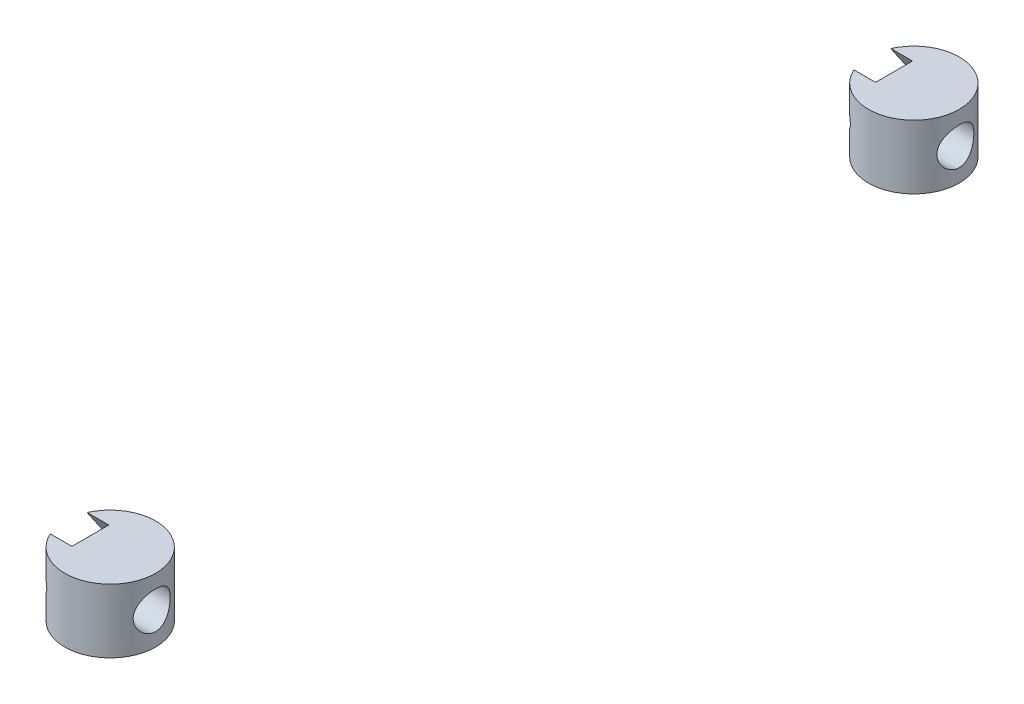
ISO-10303-21;
HEADER;
FILE_DESCRIPTION(('STEP AP214'),'2;1');
FILE_NAME('part.step','',(''),(''),'','','');
FILE_SCHEMA(('AUTOMOTIVE_DESIGN { 1 0 10303 214 1 1 1 1 }'));
ENDSEC;
DATA;
#1=APPLICATION_CONTEXT('core data for automotive mechanical design processes');
#2=APPLICATION_PROTOCOL_DEFINITION('international standard','automotive_design',2000,#1);
#3=PRODUCT_CONTEXT('',#1,'mechanical');
#4=PRODUCT('Part','Part','',(#3));
#5=PRODUCT_RELATED_PRODUCT_CATEGORY('part','',(#4));
#6=PRODUCT_DEFINITION_FORMATION('','',#4);
#7=PRODUCT_DEFINITION_CONTEXT('part definition',#1,'design');
#8=PRODUCT_DEFINITION('design','',#6,#7);
#9=PRODUCT_DEFINITION_SHAPE('','',#8);
#10=(LENGTH_UNIT() NAMED_UNIT(*) SI_UNIT(.MILLI.,.METRE.));
#11=(NAMED_UNIT(*) PLANE_ANGLE_UNIT() SI_UNIT($,.RADIAN.));
#12=(NAMED_UNIT(*) SI_UNIT($,.STERADIAN.) SOLID_ANGLE_UNIT());
#13=UNCERTAINTY_MEASURE_WITH_UNIT(LENGTH_MEASURE(1.E-05),#10,'distance_accuracy_value','');
#14=(GEOMETRIC_REPRESENTATION_CONTEXT(3) GLOBAL_UNCERTAINTY_ASSIGNED_CONTEXT((#13)) GLOBAL_UNIT_ASSIGNED_CONTEXT((#10,
#11,#12)) REPRESENTATION_CONTEXT('',''));
#15=CARTESIAN_POINT('',(0.,0.,0.));
#16=DIRECTION('',(0.,0.,1.));
#17=DIRECTION('',(1.,0.,0.));
#18=AXIS2_PLACEMENT_3D('',#15,#16,#17);
#19=CARTESIAN_POINT('',(-9.025,6.35,79.875));
#20=DIRECTION('',(1.,0.,0.));
#21=DIRECTION('',(0.,0.,-1.));
#22=AXIS2_PLACEMENT_3D('',#19,#20,#21);
#23=CYLINDRICAL_SURFACE('',#22,3.675);
#24=CARTESIAN_POINT('',(8.24287571178894,6.35,76.2));
#25=CARTESIAN_POINT('',(8.24287635200835,6.25172209193004,76.2000006435663));
#26=CARTESIAN_POINT('',(8.24463950445115,6.15340636895207,76.2039482242921));
#27=CARTESIAN_POINT('',(8.2516341947821,5.95748755176272,76.2196983826287));
#28=CARTESIAN_POINT('',(8.25686806215964,5.85988498072126,76.2315062359517));
#29=CARTESIAN_POINT('',(8.27064458742844,5.66594535724324,76.2628872681414));
#30=CARTESIAN_POINT('',(8.27919443665083,5.56961152904888,76.2824773264413));
#31=CARTESIAN_POINT('',(8.29931572789662,5.37910343025143,76.3292104976651));
#32=CARTESIAN_POINT('',(8.31088843780253,5.28493008389492,76.3563567802206));
#33=CARTESIAN_POINT('',(8.34950112738414,5.00742795623176,76.4484965304055));
#34=CARTESIAN_POINT('',(8.38051193052206,4.8281262358787,76.524354005083));
#35=CARTESIAN_POINT('',(8.44955969315188,4.48494141418247,76.7025187377141));
#36=CARTESIAN_POINT('',(8.48759476947753,4.32105419803325,76.8048189094671));
#37=CARTESIAN_POINT('',(8.56894038089361,4.00339374462748,77.0394933161994));
#38=CARTESIAN_POINT('',(8.61242467515414,3.85063969934235,77.1731899136823));
#39=CARTESIAN_POINT('',(8.69833612153945,3.56897779638049,77.4640749448378));
#40=CARTESIAN_POINT('',(8.74076287145229,3.44007889521944,77.6212721620351));
#41=CARTESIAN_POINT('',(8.821874135843,3.20465562489746,77.962635283187));
#42=CARTESIAN_POINT('',(8.86033318135837,3.09926856531821,78.1476440521105));
#43=CARTESIAN_POINT('',(8.92706239153422,2.92155175218724,78.534611041429));
#44=CARTESIAN_POINT('',(8.95533688584077,2.84920794780613,78.7365620142475));
#45=CARTESIAN_POINT('',(8.99728123604548,2.74329576015924,79.1409766868008));
#46=CARTESIAN_POINT('',(9.01161028022033,2.70797042253651,79.3429105009561));
#47=CARTESIAN_POINT('',(9.02643689795595,2.67143219850026,79.7503140089371));
#48=CARTESIAN_POINT('',(9.02693981697954,2.67020612861014,79.9557823055151));
#49=CARTESIAN_POINT('',(9.01445308137315,2.70095617123781,80.3516899570414));
#50=CARTESIAN_POINT('',(9.00224664639766,2.73100491781053,80.542308253818));
#51=CARTESIAN_POINT('',(8.96677695328529,2.82016237175298,80.9155239627416));
#52=CARTESIAN_POINT('',(8.94351288226197,2.87927321559261,81.098120784123));
#53=CARTESIAN_POINT('',(8.88774687972276,3.02559431545221,81.4534294263568));
#54=CARTESIAN_POINT('',(8.85511017828501,3.11321719115932,81.625949297497));
#55=CARTESIAN_POINT('',(8.78381848591454,3.31368115092225,81.95428510923));
#56=CARTESIAN_POINT('',(8.74516140393479,3.42653100296634,82.1100952141811));
#57=CARTESIAN_POINT('',(8.66264265950523,3.68314666108434,82.4117978955274));
#58=CARTESIAN_POINT('',(8.61860582477254,3.82848885606257,82.5563037368879));
#59=CARTESIAN_POINT('',(8.53228763369566,4.14148509819779,82.8194720867788));
#60=CARTESIAN_POINT('',(8.4900068992191,4.30914696225721,82.9381255025843));
#61=CARTESIAN_POINT('',(8.41077118272341,4.66844482022331,83.1495565547352));
#62=CARTESIAN_POINT('',(8.37401547120769,4.8606516918592,83.2414450666085));
#63=CARTESIAN_POINT('',(8.31234279260891,5.25970641210512,83.3909925670086));
#64=CARTESIAN_POINT('',(8.28741780684716,5.46654423452068,83.4486747466771));
#65=CARTESIAN_POINT('',(8.25419279568773,5.87512708363286,83.5247333104287));
#66=CARTESIAN_POINT('',(8.24494769967969,6.07637724944273,83.5453490013328));
#67=CARTESIAN_POINT('',(8.24143255370913,6.47963007174617,83.5532403958429));
#68=CARTESIAN_POINT('',(8.24715769792191,6.68163246596572,83.5405267989876));
#69=CARTESIAN_POINT('',(8.27196520700345,7.06791511332102,83.4841614945367));
#70=CARTESIAN_POINT('',(8.29022645502155,7.25253191562638,83.4424096999523));
#71=CARTESIAN_POINT('',(8.33701683509443,7.61200484974517,83.3316404564726));
#72=CARTESIAN_POINT('',(8.36554829622212,7.78685875713687,83.2626168225386));
#73=CARTESIAN_POINT('',(8.43110547035255,8.12991416969162,83.0960844521227));
#74=CARTESIAN_POINT('',(8.4684336851875,8.29754146280155,82.9975156956635));
#75=CARTESIAN_POINT('',(8.54693065916348,8.6146579401236,82.7757621673222));
#76=CARTESIAN_POINT('',(8.58810102148374,8.76413949242629,82.6525670951274));
#77=CARTESIAN_POINT('',(8.67347379009378,9.05270258610971,82.3738565151429));
#78=CARTESIAN_POINT('',(8.7176653360997,9.19009474251,82.2165818364197));
#79=CARTESIAN_POINT('',(8.80113256404693,9.43681675245223,81.8801663884421));
#80=CARTESIAN_POINT('',(8.8404079792371,9.54614508357813,81.7010244337018));
#81=CARTESIAN_POINT('',(8.90979537682365,9.73334723914072,81.325067867124));
#82=CARTESIAN_POINT('',(8.93989906023429,9.81119259712773,81.1282374572668));
#83=CARTESIAN_POINT('',(8.98740936617443,9.93212958495293,80.7227415304938));
#84=CARTESIAN_POINT('',(9.00482316773469,9.97524086631648,80.5140827773405));
#85=CARTESIAN_POINT('',(9.02419972547081,10.0230925942599,80.1059920022592));
#86=CARTESIAN_POINT('',(9.02712289370004,10.030218715373,79.9068832759984));
#87=CARTESIAN_POINT('',(9.01981023820307,10.012246501791,79.5103938060765));
#88=CARTESIAN_POINT('',(9.00957654258989,9.98715337853588,79.3130127881586));
#89=CARTESIAN_POINT('',(8.97759134956026,9.90716465674415,78.9322188325613));
#90=CARTESIAN_POINT('',(8.95622770323864,9.85327114355812,78.748560172301));
#91=CARTESIAN_POINT('',(8.90429361461325,9.71828048169847,78.39293867393));
#92=CARTESIAN_POINT('',(8.87372138448023,9.6371780501162,78.220978114938));
#93=CARTESIAN_POINT('',(8.80465480899495,9.44600292489272,77.8851814845139));
#94=CARTESIAN_POINT('',(8.76586746309063,9.3347974441483,77.722052025764));
#95=CARTESIAN_POINT('',(8.68501247715117,9.08824463756887,77.4160839970443));
#96=CARTESIAN_POINT('',(8.64294369237785,8.95288886545331,77.2732525575668));
#97=CARTESIAN_POINT('',(8.55688244327784,8.65160917107083,77.0023925863474));
#98=CARTESIAN_POINT('',(8.51294070594262,8.48427751251768,76.8759110416483));
#99=CARTESIAN_POINT('',(8.43095316803738,8.12922979473681,76.6525971381483));
#100=CARTESIAN_POINT('',(8.39291059170069,7.94150268286357,76.5557809651779));
#101=CARTESIAN_POINT('',(8.34409768743806,7.64929494245797,76.4357432301747));
#102=CARTESIAN_POINT('',(8.32923800988524,7.55047135087831,76.4000064683778));
#103=CARTESIAN_POINT('',(8.30268862303679,7.34975217087458,76.337040054348));
#104=CARTESIAN_POINT('',(8.29099737229579,7.24785810315077,76.3098062644197));
#105=CARTESIAN_POINT('',(8.27124353271442,7.04205504875809,76.2642146240913));
#106=CARTESIAN_POINT('',(8.2631713477964,6.93815216178343,76.2458332913668));
#107=CARTESIAN_POINT('',(8.25092373196701,6.72897571172968,76.218072851351));
#108=CARTESIAN_POINT('',(8.24674523427927,6.62370329371421,76.2086866590708));
#109=CARTESIAN_POINT('',(8.24402032780168,6.49021203930896,76.202568404048));
#110=CARTESIAN_POINT('',(8.24359134458015,6.46218098581238,76.2016054991886));
#111=CARTESIAN_POINT('',(8.24301894449513,6.40610098190794,76.2003212037259));
#112=CARTESIAN_POINT('',(8.24287552904742,6.37805203141203,76.1999998163031));
#113=CARTESIAN_POINT('',(8.24287571178894,6.35,76.2));
#114=B_SPLINE_CURVE_WITH_KNOTS('',3,(#24,#25,#26,#27,#28,#29,#30,#31,#32,#33,#34,#35,#36,#37,
#38,#39,#40,#41,#42,#43,#44,#45,#46,#47,#48,#49,#50,#51,#52,#53,#54,#55,#56,#57,#58,#59,#60,#61,
#62,#63,#64,#65,#66,#67,#68,#69,#70,#71,#72,#73,#74,#75,#76,#77,#78,#79,#80,#81,#82,#83,#84,#85,
#86,#87,#88,#89,#90,#91,#92,#93,#94,#95,#96,#97,#98,#99,#100,#101,#102,#103,#104,#105,#106,#107,
#108,#109,#110,#111,#112,#113),.UNSPECIFIED.,.T.,.F.,(4,2,2,2,2,2,2,2,2,2,2,2,2,2,2,2,2,2,2,2,2,
2,2,2,2,2,2,2,2,2,2,2,2,2,2,2,2,2,2,2,2,2,2,2,4),(0.,0.294804188916927,0.58980644632139,
0.885452081677048,1.18122191975236,1.76977849951031,2.35817751917346,2.9782472090168,
3.59854923644961,4.24434528218109,4.88986646283033,5.50313117295886,6.11615877906913,
6.69352390455187,7.27093148077985,7.857097336015,8.44346723902179,9.06955698195067,
9.69586657677613,10.3410804714088,10.9858564235891,11.5901727785578,12.1942951565536,
12.7622100645096,13.3302538450987,13.9217907040224,14.5135755014523,15.1509685846609,
15.7883962380846,16.4263989627131,17.0640404700697,17.658796487591,18.253456315868,
18.8286572916528,19.4039700136862,20.0049956742599,20.6062319500066,21.2462114962225,
21.8865396047503,22.2045804601897,22.5224663092809,22.839504214647,23.1562922005524,
23.2404394471741,23.3245871109808),.UNSPECIFIED.);
#115=CARTESIAN_POINT('',(8.24287571178894,6.35,76.2));
#116=VERTEX_POINT('',#115);
#117=EDGE_CURVE('E12',#116,#116,#114,.T.);
#118=ORIENTED_EDGE('',*,*,#117,.F.);
#119=EDGE_LOOP('',(#118));
#120=FACE_BOUND('',#119,.T.);
#121=CARTESIAN_POINT('',(-3.945,6.35,79.875));
#122=DIRECTION('',(-1.,0.,0.));
#123=DIRECTION('',(0.,0.,1.));
#124=AXIS2_PLACEMENT_3D('',#121,#122,#123);
#125=CIRCLE('',#124,3.675);
#126=CARTESIAN_POINT('',(-3.945,6.35,83.55));
#127=VERTEX_POINT('',#126);
#128=EDGE_CURVE('E54',#127,#127,#125,.F.);
#129=ORIENTED_EDGE('',*,*,#128,.F.);
#130=EDGE_LOOP('',(#129));
#131=FACE_BOUND('',#130,.T.);
#132=ADVANCED_FACE('F49',(#120,#131),#23,.F.);
#133=CARTESIAN_POINT('',(0.,12.7,79.875));
#134=DIRECTION('',(0.,-1.,0.));
#135=DIRECTION('',(0.,0.,-1.));
#136=AXIS2_PLACEMENT_3D('',#133,#134,#135);
#137=CYLINDRICAL_SURFACE('',#136,9.025);
#138=ORIENTED_EDGE('',*,*,#117,.T.);
#139=EDGE_LOOP('',(#138));
#140=FACE_BOUND('',#139,.T.);
#141=CARTESIAN_POINT('',(0.,0.,79.875));
#142=DIRECTION('',(0.,1.,0.));
#143=DIRECTION('',(0.,0.,1.));
#144=AXIS2_PLACEMENT_3D('',#141,#142,#143);
#145=CIRCLE('',#144,9.025);
#146=CARTESIAN_POINT('',(-8.2468049368629,0.,83.5411742093542));
#147=VERTEX_POINT('',#146);
#148=CARTESIAN_POINT('',(-8.24680493686292,0.,76.2088257906458));
#149=VERTEX_POINT('',#148);
#150=EDGE_CURVE('E126',#147,#149,#145,.T.);
#151=ORIENTED_EDGE('',*,*,#150,.T.);
#152=CARTESIAN_POINT('',(0.,-6.35000000000005,79.875));
#153=DIRECTION('',(0.,-0.499999999999998,-0.86602540378444));
#154=DIRECTION('',(0.,-0.86602540378444,0.499999999999998));
#155=AXIS2_PLACEMENT_3D('',#152,#153,#154);
#156=ELLIPSE('',#155,18.0500000000001,9.025);
#157=CARTESIAN_POINT('',(-5.2618714984943,6.35000000000001,72.5426515812917));
#158=VERTEX_POINT('',#157);
#159=EDGE_CURVE('E136',#149,#158,#156,.T.);
#160=ORIENTED_EDGE('',*,*,#159,.T.);
#161=CARTESIAN_POINT('',(0.,19.05,79.875));
#162=DIRECTION('',(0.,0.499999999999999,-0.866025403784439));
#163=DIRECTION('',(0.,-0.866025403784439,-0.499999999999999));
#164=AXIS2_PLACEMENT_3D('',#161,#162,#163);
#165=ELLIPSE('',#164,18.05,9.025);
#166=CARTESIAN_POINT('',(-8.24680493686292,12.7,76.2088257906458));
#167=VERTEX_POINT('',#166);
#168=EDGE_CURVE('E142',#158,#167,#165,.T.);
#169=ORIENTED_EDGE('',*,*,#168,.T.);
#170=CARTESIAN_POINT('',(0.,12.7,79.875));
#171=DIRECTION('',(0.,1.,0.));
#172=DIRECTION('',(0.,0.,1.));
#173=AXIS2_PLACEMENT_3D('',#170,#171,#172);
#174=CIRCLE('',#173,9.025);
#175=CARTESIAN_POINT('',(-8.24680493686293,12.7,83.5411742093541));
#176=VERTEX_POINT('',#175);
#177=EDGE_CURVE('E59',#176,#167,#174,.T.);
#178=ORIENTED_EDGE('',*,*,#177,.F.);
#179=CARTESIAN_POINT('',(0.,19.0499999999999,79.875));
#180=DIRECTION('',(0.,0.500000000000003,0.866025403784437));
#181=DIRECTION('',(0.,-0.866025403784437,0.500000000000003));
#182=AXIS2_PLACEMENT_3D('',#179,#180,#181);
#183=ELLIPSE('',#182,18.0499999999999,9.025);
#184=CARTESIAN_POINT('',(-5.26187149849428,6.35000000000002,87.2073484187082));
#185=VERTEX_POINT('',#184);
#186=EDGE_CURVE('E139',#176,#185,#183,.T.);
#187=ORIENTED_EDGE('',*,*,#186,.T.);
#188=CARTESIAN_POINT('',(0.,-6.35000000000014,79.875));
#189=DIRECTION('',(0.,-0.499999999999996,0.866025403784441));
#190=DIRECTION('',(0.,-0.866025403784441,-0.499999999999996));
#191=AXIS2_PLACEMENT_3D('',#188,#189,#190);
#192=ELLIPSE('',#191,18.0500000000001,9.025);
#193=EDGE_CURVE('E134',#185,#147,#192,.T.);
#194=ORIENTED_EDGE('',*,*,#193,.T.);
#195=EDGE_LOOP('',(#151,#160,#169,#178,#187,#194));
#196=FACE_BOUND('',#195,.T.);
#197=ADVANCED_FACE('F51',(#140,#196),#137,.T.);
#198=CARTESIAN_POINT('',(0.,12.7,79.875));
#199=DIRECTION('',(0.,1.,0.));
#200=DIRECTION('',(0.,0.,1.));
#201=AXIS2_PLACEMENT_3D('',#198,#199,#200);
#202=PLANE('',#201);
#203=DIRECTION('',(-1.,0.,0.));
#204=VECTOR('',#203,1.);
#205=CARTESIAN_POINT('',(-3.945,12.7,76.2088257906458));
#206=LINE('',#205,#204);
#207=CARTESIAN_POINT('',(-3.945,12.7,76.2088257906458));
#208=VERTEX_POINT('',#207);
#209=EDGE_CURVE('E74',#208,#167,#206,.T.);
#210=ORIENTED_EDGE('',*,*,#209,.F.);
#211=DIRECTION('',(0.,0.,-1.));
#212=VECTOR('',#211,1.);
#213=CARTESIAN_POINT('',(-3.945,12.7,83.5411742093541));
#214=LINE('',#213,#212);
#215=CARTESIAN_POINT('',(-3.945,12.7,83.5411742093541));
#216=VERTEX_POINT('',#215);
#217=EDGE_CURVE('E227',#216,#208,#214,.T.);
#218=ORIENTED_EDGE('',*,*,#217,.F.);
#219=DIRECTION('',(-1.,0.,0.));
#220=VECTOR('',#219,1.);
#221=CARTESIAN_POINT('',(-3.945,12.7,83.5411742093541));
#222=LINE('',#221,#220);
#223=EDGE_CURVE('E128',#216,#176,#222,.T.);
#224=ORIENTED_EDGE('',*,*,#223,.T.);
#225=ORIENTED_EDGE('',*,*,#177,.T.);
#226=EDGE_LOOP('',(#210,#218,#224,#225));
#227=FACE_BOUND('',#226,.T.);
#228=ADVANCED_FACE('F156',(#227),#202,.T.);
#229=CARTESIAN_POINT('',(0.,0.,79.875));
#230=DIRECTION('',(0.,1.,0.));
#231=DIRECTION('',(0.,0.,1.));
#232=AXIS2_PLACEMENT_3D('',#229,#230,#231);
#233=PLANE('',#232);
#234=DIRECTION('',(0.,0.,1.));
#235=VECTOR('',#234,1.);
#236=CARTESIAN_POINT('',(-3.945,0.,76.2088257906458));
#237=LINE('',#236,#235);
#238=CARTESIAN_POINT('',(-3.945,0.,76.2088257906458));
#239=VERTEX_POINT('',#238);
#240=CARTESIAN_POINT('',(-3.945,0.,83.5411742093542));
#241=VERTEX_POINT('',#240);
#242=EDGE_CURVE('E115',#239,#241,#237,.T.);
#243=ORIENTED_EDGE('',*,*,#242,.F.);
#244=DIRECTION('',(-1.,0.,0.));
#245=VECTOR('',#244,1.);
#246=CARTESIAN_POINT('',(-3.945,0.,76.2088257906458));
#247=LINE('',#246,#245);
#248=EDGE_CURVE('E232',#239,#149,#247,.T.);
#249=ORIENTED_EDGE('',*,*,#248,.T.);
#250=ORIENTED_EDGE('',*,*,#150,.F.);
#251=DIRECTION('',(-1.,0.,0.));
#252=VECTOR('',#251,1.);
#253=CARTESIAN_POINT('',(-3.945,0.,83.5411742093542));
#254=LINE('',#253,#252);
#255=EDGE_CURVE('E108',#241,#147,#254,.T.);
#256=ORIENTED_EDGE('',*,*,#255,.F.);
#257=EDGE_LOOP('',(#243,#249,#250,#256));
#258=FACE_BOUND('',#257,.T.);
#259=ADVANCED_FACE('F124',(#258),#233,.F.);
#260=CARTESIAN_POINT('',(-3.945,12.7,76.2088257906458));
#261=DIRECTION('',(0.,0.499999999999999,-0.866025403784439));
#262=DIRECTION('',(0.,0.866025403784439,0.499999999999999));
#263=AXIS2_PLACEMENT_3D('',#260,#261,#262);
#264=PLANE('',#263);
#265=DIRECTION('',(-1.,0.,0.));
#266=VECTOR('',#265,1.);
#267=CARTESIAN_POINT('',(-3.945,6.35000000000001,72.5426515812917));
#268=LINE('',#267,#266);
#269=CARTESIAN_POINT('',(-3.945,6.35000000000001,72.5426515812917));
#270=VERTEX_POINT('',#269);
#271=EDGE_CURVE('E234',#270,#158,#268,.T.);
#272=ORIENTED_EDGE('',*,*,#271,.F.);
#273=DIRECTION('',(0.,-0.866025403784439,-0.499999999999999));
#274=VECTOR('',#273,1.);
#275=CARTESIAN_POINT('',(-3.945,12.7,76.2088257906458));
#276=LINE('',#275,#274);
#277=EDGE_CURVE('E130',#208,#270,#276,.T.);
#278=ORIENTED_EDGE('',*,*,#277,.F.);
#279=ORIENTED_EDGE('',*,*,#209,.T.);
#280=ORIENTED_EDGE('',*,*,#168,.F.);
#281=EDGE_LOOP('',(#272,#278,#279,#280));
#282=FACE_BOUND('',#281,.T.);
#283=ADVANCED_FACE('F160',(#282),#264,.F.);
#284=CARTESIAN_POINT('',(-3.945,6.35000000000002,87.2073484187082));
#285=DIRECTION('',(0.,0.500000000000003,0.866025403784437));
#286=DIRECTION('',(0.,-0.866025403784437,0.500000000000003));
#287=AXIS2_PLACEMENT_3D('',#284,#285,#286);
#288=PLANE('',#287);
#289=ORIENTED_EDGE('',*,*,#223,.F.);
#290=DIRECTION('',(0.,0.866025403784437,-0.500000000000003));
#291=VECTOR('',#290,1.);
#292=CARTESIAN_POINT('',(-3.945,6.35000000000002,87.2073484187082));
#293=LINE('',#292,#291);
#294=CARTESIAN_POINT('',(-3.945,6.35000000000002,87.2073484187082));
#295=VERTEX_POINT('',#294);
#296=EDGE_CURVE('E114',#295,#216,#293,.T.);
#297=ORIENTED_EDGE('',*,*,#296,.F.);
#298=DIRECTION('',(-1.,0.,0.));
#299=VECTOR('',#298,1.);
#300=CARTESIAN_POINT('',(-3.945,6.35000000000002,87.2073484187082));
#301=LINE('',#300,#299);
#302=EDGE_CURVE('E111',#295,#185,#301,.T.);
#303=ORIENTED_EDGE('',*,*,#302,.T.);
#304=ORIENTED_EDGE('',*,*,#186,.F.);
#305=EDGE_LOOP('',(#289,#297,#303,#304));
#306=FACE_BOUND('',#305,.T.);
#307=ADVANCED_FACE('F164',(#306),#288,.F.);
#308=CARTESIAN_POINT('',(-3.945,6.35000000000001,72.5426515812917));
#309=DIRECTION('',(0.,-0.499999999999998,-0.86602540378444));
#310=DIRECTION('',(0.,0.86602540378444,-0.499999999999998));
#311=AXIS2_PLACEMENT_3D('',#308,#309,#310);
#312=PLANE('',#311);
#313=ORIENTED_EDGE('',*,*,#248,.F.);
#314=DIRECTION('',(0.,-0.86602540378444,0.499999999999998));
#315=VECTOR('',#314,1.);
#316=CARTESIAN_POINT('',(-3.945,6.35000000000001,72.5426515812917));
#317=LINE('',#316,#315);
#318=EDGE_CURVE('E66',#270,#239,#317,.T.);
#319=ORIENTED_EDGE('',*,*,#318,.F.);
#320=ORIENTED_EDGE('',*,*,#271,.T.);
#321=ORIENTED_EDGE('',*,*,#159,.F.);
#322=EDGE_LOOP('',(#313,#319,#320,#321));
#323=FACE_BOUND('',#322,.T.);
#324=ADVANCED_FACE('F169',(#323),#312,.F.);
#325=CARTESIAN_POINT('',(-3.945,0.,83.5411742093542));
#326=DIRECTION('',(0.,-0.499999999999996,0.866025403784441));
#327=DIRECTION('',(0.,-0.866025403784441,-0.499999999999996));
#328=AXIS2_PLACEMENT_3D('',#325,#326,#327);
#329=PLANE('',#328);
#330=ORIENTED_EDGE('',*,*,#302,.F.);
#331=DIRECTION('',(0.,0.866025403784441,0.499999999999996));
#332=VECTOR('',#331,1.);
#333=CARTESIAN_POINT('',(-3.945,0.,83.5411742093542));
#334=LINE('',#333,#332);
#335=EDGE_CURVE('E105',#241,#295,#334,.T.);
#336=ORIENTED_EDGE('',*,*,#335,.F.);
#337=ORIENTED_EDGE('',*,*,#255,.T.);
#338=ORIENTED_EDGE('',*,*,#193,.F.);
#339=EDGE_LOOP('',(#330,#336,#337,#338));
#340=FACE_BOUND('',#339,.T.);
#341=ADVANCED_FACE('F106',(#340),#329,.F.);
#342=CARTESIAN_POINT('',(-3.945,0.,0.));
#343=DIRECTION('',(-1.,0.,0.));
#344=DIRECTION('',(0.,0.,1.));
#345=AXIS2_PLACEMENT_3D('',#342,#343,#344);
#346=PLANE('',#345);
#347=ORIENTED_EDGE('',*,*,#242,.T.);
#348=ORIENTED_EDGE('',*,*,#335,.T.);
#349=ORIENTED_EDGE('',*,*,#296,.T.);
#350=ORIENTED_EDGE('',*,*,#217,.T.);
#351=ORIENTED_EDGE('',*,*,#277,.T.);
#352=ORIENTED_EDGE('',*,*,#318,.T.);
#353=EDGE_LOOP('',(#347,#348,#349,#350,#351,#352));
#354=FACE_BOUND('',#353,.T.);
#355=ORIENTED_EDGE('',*,*,#128,.T.);
#356=EDGE_LOOP('',(#355));
#357=FACE_BOUND('',#356,.T.);
#358=ADVANCED_FACE('F118',(#354,#357),#346,.T.);
#359=CLOSED_SHELL('',(#132,#197,#228,#259,#283,#307,#324,#341,#358));
#360=MANIFOLD_SOLID_BREP('B2',#359);
#361=CARTESIAN_POINT('',(0.,12.7,-79.875));
#362=DIRECTION('',(0.,-1.,0.));
#363=DIRECTION('',(0.,0.,-1.));
#364=AXIS2_PLACEMENT_3D('',#361,#362,#363);
#365=CYLINDRICAL_SURFACE('',#364,9.025);
#366=CARTESIAN_POINT('',(8.24287571178894,6.35000000000002,-83.55));
#367=CARTESIAN_POINT('',(8.24287635200835,6.25172209193005,-83.5499993564336));
#368=CARTESIAN_POINT('',(8.24463950445115,6.15340636895209,-83.5460517757079));
#369=CARTESIAN_POINT('',(8.2516341947821,5.95748755176275,-83.5303016173713));
#370=CARTESIAN_POINT('',(8.25686806215964,5.85988498072128,-83.5184937640483));
#371=CARTESIAN_POINT('',(8.27064458742844,5.66594535724326,-83.4871127318586));
#372=CARTESIAN_POINT('',(8.27919443665083,5.5696115290489,-83.4675226735587));
#373=CARTESIAN_POINT('',(8.29931572789662,5.37910343025145,-83.4207895023349));
#374=CARTESIAN_POINT('',(8.31088843780253,5.28493008389494,-83.3936432197794));
#375=CARTESIAN_POINT('',(8.34950112738415,5.00742795623178,-83.3015034695945));
#376=CARTESIAN_POINT('',(8.38051193052206,4.82812623587872,-83.225645994917));
#377=CARTESIAN_POINT('',(8.44955969315188,4.48494141418248,-83.0474812622859));
#378=CARTESIAN_POINT('',(8.48759476947754,4.32105419803326,-82.9451810905329));
#379=CARTESIAN_POINT('',(8.56894038089361,4.0033937446275,-82.7105066838006));
#380=CARTESIAN_POINT('',(8.61242467515414,3.85063969934237,-82.5768100863176));
#381=CARTESIAN_POINT('',(8.69833612153945,3.56897779638052,-82.2859250551622));
#382=CARTESIAN_POINT('',(8.74076287145229,3.44007889521946,-82.1287278379649));
#383=CARTESIAN_POINT('',(8.821874135843,3.20465562489748,-81.7873647168129));
#384=CARTESIAN_POINT('',(8.86033318135837,3.09926856531824,-81.6023559478895));
#385=CARTESIAN_POINT('',(8.92706239153422,2.92155175218727,-81.215388958571));
#386=CARTESIAN_POINT('',(8.95533688584077,2.84920794780616,-81.0134379857524));
#387=CARTESIAN_POINT('',(8.99728123604548,2.74329576015925,-80.6090233131992));
#388=CARTESIAN_POINT('',(9.01161028022033,2.70797042253653,-80.4070894990439));
#389=CARTESIAN_POINT('',(9.02643689795595,2.67143219850028,-79.9996859910629));
#390=CARTESIAN_POINT('',(9.02693981697954,2.67020612861016,-79.7942176944849));
#391=CARTESIAN_POINT('',(9.01445308137315,2.70095617123783,-79.3983100429586));
#392=CARTESIAN_POINT('',(9.00224664639766,2.73100491781054,-79.207691746182));
#393=CARTESIAN_POINT('',(8.96677695328529,2.820162371753,-78.8344760372584));
#394=CARTESIAN_POINT('',(8.94351288226197,2.87927321559263,-78.651879215877));
#395=CARTESIAN_POINT('',(8.88774687972276,3.02559431545223,-78.2965705736432));
#396=CARTESIAN_POINT('',(8.85511017828501,3.11321719115934,-78.124050702503));
#397=CARTESIAN_POINT('',(8.78381848591454,3.31368115092227,-77.79571489077));
#398=CARTESIAN_POINT('',(8.74516140393479,3.42653100296636,-77.6399047858189));
#399=CARTESIAN_POINT('',(8.66264265950523,3.68314666108436,-77.3382021044726));
#400=CARTESIAN_POINT('',(8.61860582477254,3.82848885606259,-77.193696263112));
#401=CARTESIAN_POINT('',(8.53228763369566,4.14148509819781,-76.9305279132212));
#402=CARTESIAN_POINT('',(8.4900068992191,4.30914696225723,-76.8118744974157));
#403=CARTESIAN_POINT('',(8.41077118272341,4.66844482022333,-76.6004434452648));
#404=CARTESIAN_POINT('',(8.37401547120769,4.86065169185922,-76.5085549333914));
#405=CARTESIAN_POINT('',(8.31234279260892,5.25970641210514,-76.3590074329914));
#406=CARTESIAN_POINT('',(8.28741780684716,5.4665442345207,-76.3013252533229));
#407=CARTESIAN_POINT('',(8.25419279568773,5.87512708363288,-76.2252666895713));
#408=CARTESIAN_POINT('',(8.24494769967969,6.07637724944275,-76.2046509986672));
#409=CARTESIAN_POINT('',(8.24143255370913,6.47963007174619,-76.1967596041571));
#410=CARTESIAN_POINT('',(8.24715769792191,6.68163246596574,-76.2094732010124));
#411=CARTESIAN_POINT('',(8.27196520700345,7.06791511332104,-76.2658385054633));
#412=CARTESIAN_POINT('',(8.29022645502155,7.25253191562641,-76.3075903000477));
#413=CARTESIAN_POINT('',(8.33701683509443,7.61200484974519,-76.4183595435274));
#414=CARTESIAN_POINT('',(8.36554829622212,7.78685875713689,-76.4873831774614));
#415=CARTESIAN_POINT('',(8.43110547035255,8.12991416969164,-76.6539155478772));
#416=CARTESIAN_POINT('',(8.46843368518749,8.29754146280156,-76.7524843043365));
#417=CARTESIAN_POINT('',(8.54693065916347,8.61465794012362,-76.9742378326777));
#418=CARTESIAN_POINT('',(8.58810102148374,8.76413949242631,-77.0974329048726));
#419=CARTESIAN_POINT('',(8.67347379009378,9.05270258610973,-77.376143484857));
#420=CARTESIAN_POINT('',(8.7176653360997,9.19009474251002,-77.5334181635803));
#421=CARTESIAN_POINT('',(8.80113256404693,9.43681675245225,-77.8698336115579));
#422=CARTESIAN_POINT('',(8.8404079792371,9.54614508357816,-78.0489755662982));
#423=CARTESIAN_POINT('',(8.90979537682365,9.73334723914074,-78.4249321328759));
#424=CARTESIAN_POINT('',(8.93989906023429,9.81119259712775,-78.6217625427332));
#425=CARTESIAN_POINT('',(8.98740936617443,9.93212958495295,-79.0272584695062));
#426=CARTESIAN_POINT('',(9.00482316773469,9.9752408663165,-79.2359172226595));
#427=CARTESIAN_POINT('',(9.02419972547081,10.0230925942599,-79.6440079977407));
#428=CARTESIAN_POINT('',(9.02712289370004,10.030218715373,-79.8431167240016));
#429=CARTESIAN_POINT('',(9.01981023820307,10.012246501791,-80.2396061939235));
#430=CARTESIAN_POINT('',(9.00957654258989,9.9871533785359,-80.4369872118414));
#431=CARTESIAN_POINT('',(8.97759134956026,9.90716465674417,-80.8177811674387));
#432=CARTESIAN_POINT('',(8.95622770323864,9.85327114355813,-81.001439827699));
#433=CARTESIAN_POINT('',(8.90429361461324,9.71828048169849,-81.35706132607));
#434=CARTESIAN_POINT('',(8.87372138448023,9.63717805011622,-81.5290218850619));
#435=CARTESIAN_POINT('',(8.80465480899495,9.44600292489274,-81.8648185154861));
#436=CARTESIAN_POINT('',(8.76586746309063,9.33479744414832,-82.027947974236));
#437=CARTESIAN_POINT('',(8.68501247715117,9.08824463756889,-82.3339160029557));
#438=CARTESIAN_POINT('',(8.64294369237785,8.95288886545333,-82.4767474424332));
#439=CARTESIAN_POINT('',(8.55688244327784,8.65160917107084,-82.7476074136526));
#440=CARTESIAN_POINT('',(8.51294070594261,8.48427751251769,-82.8740889583517));
#441=CARTESIAN_POINT('',(8.43095316803738,8.12922979473682,-83.0974028618517));
#442=CARTESIAN_POINT('',(8.39291059170069,7.94150268286358,-83.1942190348221));
#443=CARTESIAN_POINT('',(8.34409768743806,7.64929494245799,-83.3142567698252));
#444=CARTESIAN_POINT('',(8.32923800988524,7.55047135087833,-83.3499935316222));
#445=CARTESIAN_POINT('',(8.30268862303679,7.34975217087459,-83.412959945652));
#446=CARTESIAN_POINT('',(8.2909973722958,7.24785810315079,-83.4401937355803));
#447=CARTESIAN_POINT('',(8.27124353271442,7.0420550487581,-83.4857853759087));
#448=CARTESIAN_POINT('',(8.2631713477964,6.93815216178344,-83.5041667086332));
#449=CARTESIAN_POINT('',(8.25092373196701,6.72897571172969,-83.531927148649));
#450=CARTESIAN_POINT('',(8.24674523427927,6.62370329371423,-83.5413133409291));
#451=CARTESIAN_POINT('',(8.24402032780168,6.49021203930898,-83.547431595952));
#452=CARTESIAN_POINT('',(8.24359134458015,6.4621809858124,-83.5483945008114));
#453=CARTESIAN_POINT('',(8.24301894449513,6.40610098190795,-83.549678796274));
#454=CARTESIAN_POINT('',(8.24287552904742,6.37805203141204,-83.5500001836969));
#455=CARTESIAN_POINT('',(8.24287571178894,6.35000000000002,-83.55));
#456=B_SPLINE_CURVE_WITH_KNOTS('',3,(#366,#367,#368,#369,#370,#371,#372,#373,#374,#375,#376,
#377,#378,#379,#380,#381,#382,#383,#384,#385,#386,#387,#388,#389,#390,#391,#392,#393,#394,#395,
#396,#397,#398,#399,#400,#401,#402,#403,#404,#405,#406,#407,#408,#409,#410,#411,#412,#413,#414,
#415,#416,#417,#418,#419,#420,#421,#422,#423,#424,#425,#426,#427,#428,#429,#430,#431,#432,#433,
#434,#435,#436,#437,#438,#439,#440,#441,#442,#443,#444,#445,#446,#447,#448,#449,#450,#451,#452,
#453,#454,#455),.UNSPECIFIED.,.T.,.F.,(4,2,2,2,2,2,2,2,2,2,2,2,2,2,2,2,2,2,2,2,2,2,2,2,2,2,2,2,
2,2,2,2,2,2,2,2,2,2,2,2,2,2,2,2,4),(0.,0.294804188916926,0.58980644632139,0.885452081677048,
1.18122191975236,1.76977849951032,2.35817751917346,2.9782472090168,3.59854923644961,
4.24434528218107,4.88986646283033,5.50313117295886,6.11615877906913,6.69352390455187,
7.27093148077985,7.857097336015,8.44346723902179,9.06955698195067,9.69586657677613,
10.3410804714088,10.9858564235891,11.5901727785578,12.1942951565536,12.7622100645096,
13.3302538450987,13.9217907040224,14.5135755014523,15.1509685846609,15.7883962380846,
16.4263989627131,17.0640404700697,17.658796487591,18.253456315868,18.8286572916528,
19.4039700136862,20.0049956742599,20.6062319500066,21.2462114962225,21.8865396047503,
22.2045804601896,22.5224663092809,22.839504214647,23.1562922005524,23.2404394471741,
23.3245871109808),.UNSPECIFIED.);
#457=CARTESIAN_POINT('',(8.24287571178894,6.35000000000002,-83.55));
#458=VERTEX_POINT('',#457);
#459=EDGE_CURVE('E47',#458,#458,#456,.T.);
#460=ORIENTED_EDGE('',*,*,#459,.T.);
#461=EDGE_LOOP('',(#460));
#462=FACE_BOUND('',#461,.T.);
#463=CARTESIAN_POINT('',(0.,0.,-79.875));
#464=DIRECTION('',(0.,1.,0.));
#465=DIRECTION('',(0.,0.,1.));
#466=AXIS2_PLACEMENT_3D('',#463,#464,#465);
#467=CIRCLE('',#466,9.025);
#468=CARTESIAN_POINT('',(-8.24680493686292,0.,-76.2088257906458));
#469=VERTEX_POINT('',#468);
#470=CARTESIAN_POINT('',(-8.2468049368629,0.,-83.5411742093542));
#471=VERTEX_POINT('',#470);
#472=EDGE_CURVE('E372',#469,#471,#467,.T.);
#473=ORIENTED_EDGE('',*,*,#472,.T.);
#474=CARTESIAN_POINT('',(0.,-6.35000000000014,-79.875));
#475=DIRECTION('',(0.,-0.499999999999996,-0.866025403784441));
#476=DIRECTION('',(0.,-0.866025403784441,0.499999999999996));
#477=AXIS2_PLACEMENT_3D('',#474,#475,#476);
#478=ELLIPSE('',#477,18.0500000000001,9.025);
#479=CARTESIAN_POINT('',(-5.26187149849428,6.35000000000002,-87.2073484187082));
#480=VERTEX_POINT('',#479);
#481=EDGE_CURVE('E360',#471,#480,#478,.T.);
#482=ORIENTED_EDGE('',*,*,#481,.T.);
#483=CARTESIAN_POINT('',(0.,19.0499999999999,-79.875));
#484=DIRECTION('',(0.,0.500000000000003,-0.866025403784437));
#485=DIRECTION('',(0.,-0.866025403784437,-0.500000000000003));
#486=AXIS2_PLACEMENT_3D('',#483,#484,#485);
#487=ELLIPSE('',#486,18.0499999999999,9.025);
#488=CARTESIAN_POINT('',(-8.24680493686293,12.7,-83.5411742093541));
#489=VERTEX_POINT('',#488);
#490=EDGE_CURVE('E369',#480,#489,#487,.T.);
#491=ORIENTED_EDGE('',*,*,#490,.T.);
#492=CARTESIAN_POINT('',(0.,12.7,-79.875));
#493=DIRECTION('',(0.,1.,0.));
#494=DIRECTION('',(0.,0.,1.));
#495=AXIS2_PLACEMENT_3D('',#492,#493,#494);
#496=CIRCLE('',#495,9.025);
#497=CARTESIAN_POINT('',(-8.24680493686292,12.7,-76.2088257906458));
#498=VERTEX_POINT('',#497);
#499=EDGE_CURVE('E261',#498,#489,#496,.T.);
#500=ORIENTED_EDGE('',*,*,#499,.F.);
#501=CARTESIAN_POINT('',(0.,19.05,-79.875));
#502=DIRECTION('',(0.,0.499999999999999,0.866025403784439));
#503=DIRECTION('',(0.,-0.866025403784439,0.499999999999999));
#504=AXIS2_PLACEMENT_3D('',#501,#502,#503);
#505=ELLIPSE('',#504,18.05,9.025);
#506=CARTESIAN_POINT('',(-5.2618714984943,6.35000000000001,-72.5426515812917));
#507=VERTEX_POINT('',#506);
#508=EDGE_CURVE('E366',#498,#507,#505,.T.);
#509=ORIENTED_EDGE('',*,*,#508,.T.);
#510=CARTESIAN_POINT('',(0.,-6.35000000000005,-79.875));
#511=DIRECTION('',(0.,-0.499999999999998,0.86602540378444));
#512=DIRECTION('',(0.,-0.86602540378444,-0.499999999999998));
#513=AXIS2_PLACEMENT_3D('',#510,#511,#512);
#514=ELLIPSE('',#513,18.0500000000001,9.025);
#515=EDGE_CURVE('E313',#507,#469,#514,.T.);
#516=ORIENTED_EDGE('',*,*,#515,.T.);
#517=EDGE_LOOP('',(#473,#482,#491,#500,#509,#516));
#518=FACE_BOUND('',#517,.T.);
#519=ADVANCED_FACE('F251',(#462,#518),#365,.T.);
#520=CARTESIAN_POINT('',(0.,12.7,-79.875));
#521=DIRECTION('',(0.,1.,0.));
#522=DIRECTION('',(0.,0.,1.));
#523=AXIS2_PLACEMENT_3D('',#520,#521,#522);
#524=PLANE('',#523);
#525=DIRECTION('',(-1.,0.,0.));
#526=VECTOR('',#525,1.);
#527=CARTESIAN_POINT('',(-3.945,12.7,-83.5411742093541));
#528=LINE('',#527,#526);
#529=CARTESIAN_POINT('',(-3.945,12.7,-83.5411742093541));
#530=VERTEX_POINT('',#529);
#531=EDGE_CURVE('E276',#530,#489,#528,.T.);
#532=ORIENTED_EDGE('',*,*,#531,.F.);
#533=DIRECTION('',(0.,0.,-1.));
#534=VECTOR('',#533,1.);
#535=CARTESIAN_POINT('',(-3.945,12.7,-83.5411742093541));
#536=LINE('',#535,#534);
#537=CARTESIAN_POINT('',(-3.945,12.7,-76.2088257906458));
#538=VERTEX_POINT('',#537);
#539=EDGE_CURVE('E327',#538,#530,#536,.T.);
#540=ORIENTED_EDGE('',*,*,#539,.F.);
#541=DIRECTION('',(-1.,0.,0.));
#542=VECTOR('',#541,1.);
#543=CARTESIAN_POINT('',(-3.945,12.7,-76.2088257906458));
#544=LINE('',#543,#542);
#545=EDGE_CURVE('E317',#538,#498,#544,.T.);
#546=ORIENTED_EDGE('',*,*,#545,.T.);
#547=ORIENTED_EDGE('',*,*,#499,.T.);
#548=EDGE_LOOP('',(#532,#540,#546,#547));
#549=FACE_BOUND('',#548,.T.);
#550=ADVANCED_FACE('F391',(#549),#524,.T.);
#551=CARTESIAN_POINT('',(0.,0.,-79.875));
#552=DIRECTION('',(0.,1.,0.));
#553=DIRECTION('',(0.,0.,1.));
#554=AXIS2_PLACEMENT_3D('',#551,#552,#553);
#555=PLANE('',#554);
#556=ORIENTED_EDGE('',*,*,#472,.F.);
#557=DIRECTION('',(-1.,0.,0.));
#558=VECTOR('',#557,1.);
#559=CARTESIAN_POINT('',(-3.945,0.,-76.2088257906458));
#560=LINE('',#559,#558);
#561=CARTESIAN_POINT('',(-3.945,0.,-76.2088257906458));
#562=VERTEX_POINT('',#561);
#563=EDGE_CURVE('E345',#562,#469,#560,.T.);
#564=ORIENTED_EDGE('',*,*,#563,.F.);
#565=DIRECTION('',(0.,0.,1.));
#566=VECTOR('',#565,1.);
#567=CARTESIAN_POINT('',(-3.945,0.,-76.2088257906458));
#568=LINE('',#567,#566);
#569=CARTESIAN_POINT('',(-3.945,0.,-83.5411742093542));
#570=VERTEX_POINT('',#569);
#571=EDGE_CURVE('E318',#570,#562,#568,.T.);
#572=ORIENTED_EDGE('',*,*,#571,.F.);
#573=DIRECTION('',(-1.,0.,0.));
#574=VECTOR('',#573,1.);
#575=CARTESIAN_POINT('',(-3.945,0.,-83.5411742093542));
#576=LINE('',#575,#574);
#577=EDGE_CURVE('E348',#570,#471,#576,.T.);
#578=ORIENTED_EDGE('',*,*,#577,.T.);
#579=EDGE_LOOP('',(#556,#564,#572,#578));
#580=FACE_BOUND('',#579,.T.);
#581=ADVANCED_FACE('F388',(#580),#555,.F.);
#582=CARTESIAN_POINT('',(-9.025,6.35000000000002,-79.875));
#583=DIRECTION('',(1.,0.,0.));
#584=DIRECTION('',(0.,0.,-1.));
#585=AXIS2_PLACEMENT_3D('',#582,#583,#584);
#586=CYLINDRICAL_SURFACE('',#585,3.675);
#587=CARTESIAN_POINT('',(-3.945,6.35000000000002,-79.875));
#588=DIRECTION('',(1.,0.,0.));
#589=DIRECTION('',(0.,0.,-1.));
#590=AXIS2_PLACEMENT_3D('',#587,#588,#589);
#591=CIRCLE('',#590,3.675);
#592=CARTESIAN_POINT('',(-3.945,6.35000000000002,-83.55));
#593=VERTEX_POINT('',#592);
#594=EDGE_CURVE('E255',#593,#593,#591,.F.);
#595=ORIENTED_EDGE('',*,*,#594,.T.);
#596=EDGE_LOOP('',(#595));
#597=FACE_BOUND('',#596,.T.);
#598=ORIENTED_EDGE('',*,*,#459,.F.);
#599=EDGE_LOOP('',(#598));
#600=FACE_BOUND('',#599,.T.);
#601=ADVANCED_FACE('F382',(#597,#600),#586,.F.);
#602=CARTESIAN_POINT('',(-3.945,6.35000000000002,-87.2073484187082));
#603=DIRECTION('',(0.,0.500000000000003,-0.866025403784437));
#604=DIRECTION('',(0.,0.866025403784437,0.500000000000003));
#605=AXIS2_PLACEMENT_3D('',#602,#603,#604);
#606=PLANE('',#605);
#607=DIRECTION('',(-1.,0.,0.));
#608=VECTOR('',#607,1.);
#609=CARTESIAN_POINT('',(-3.945,6.35000000000002,-87.2073484187082));
#610=LINE('',#609,#608);
#611=CARTESIAN_POINT('',(-3.945,6.35000000000002,-87.2073484187082));
#612=VERTEX_POINT('',#611);
#613=EDGE_CURVE('E352',#612,#480,#610,.T.);
#614=ORIENTED_EDGE('',*,*,#613,.F.);
#615=DIRECTION('',(0.,-0.866025403784437,-0.500000000000003));
#616=VECTOR('',#615,1.);
#617=CARTESIAN_POINT('',(-3.945,6.35000000000002,-87.2073484187082));
#618=LINE('',#617,#616);
#619=EDGE_CURVE('E338',#530,#612,#618,.T.);
#620=ORIENTED_EDGE('',*,*,#619,.F.);
#621=ORIENTED_EDGE('',*,*,#531,.T.);
#622=ORIENTED_EDGE('',*,*,#490,.F.);
#623=EDGE_LOOP('',(#614,#620,#621,#622));
#624=FACE_BOUND('',#623,.T.);
#625=ADVANCED_FACE('F387',(#624),#606,.F.);
#626=CARTESIAN_POINT('',(-3.945,12.7,-76.2088257906458));
#627=DIRECTION('',(0.,0.499999999999999,0.866025403784439));
#628=DIRECTION('',(0.,-0.866025403784439,0.499999999999999));
#629=AXIS2_PLACEMENT_3D('',#626,#627,#628);
#630=PLANE('',#629);
#631=ORIENTED_EDGE('',*,*,#545,.F.);
#632=DIRECTION('',(0.,0.866025403784439,-0.499999999999999));
#633=VECTOR('',#632,1.);
#634=CARTESIAN_POINT('',(-3.945,12.7,-76.2088257906458));
#635=LINE('',#634,#633);
#636=CARTESIAN_POINT('',(-3.945,6.35000000000001,-72.5426515812917));
#637=VERTEX_POINT('',#636);
#638=EDGE_CURVE('E321',#637,#538,#635,.T.);
#639=ORIENTED_EDGE('',*,*,#638,.F.);
#640=DIRECTION('',(-1.,0.,0.));
#641=VECTOR('',#640,1.);
#642=CARTESIAN_POINT('',(-3.945,6.35000000000001,-72.5426515812917));
#643=LINE('',#642,#641);
#644=EDGE_CURVE('E307',#637,#507,#643,.T.);
#645=ORIENTED_EDGE('',*,*,#644,.T.);
#646=ORIENTED_EDGE('',*,*,#508,.F.);
#647=EDGE_LOOP('',(#631,#639,#645,#646));
#648=FACE_BOUND('',#647,.T.);
#649=ADVANCED_FACE('F322',(#648),#630,.F.);
#650=CARTESIAN_POINT('',(-3.945,6.35000000000001,-72.5426515812917));
#651=DIRECTION('',(0.,-0.499999999999998,0.86602540378444));
#652=DIRECTION('',(0.,-0.86602540378444,-0.499999999999998));
#653=AXIS2_PLACEMENT_3D('',#650,#651,#652);
#654=PLANE('',#653);
#655=ORIENTED_EDGE('',*,*,#644,.F.);
#656=DIRECTION('',(0.,0.86602540378444,0.499999999999998));
#657=VECTOR('',#656,1.);
#658=CARTESIAN_POINT('',(-3.945,6.35000000000001,-72.5426515812917));
#659=LINE('',#658,#657);
#660=EDGE_CURVE('E311',#562,#637,#659,.T.);
#661=ORIENTED_EDGE('',*,*,#660,.F.);
#662=ORIENTED_EDGE('',*,*,#563,.T.);
#663=ORIENTED_EDGE('',*,*,#515,.F.);
#664=EDGE_LOOP('',(#655,#661,#662,#663));
#665=FACE_BOUND('',#664,.T.);
#666=ADVANCED_FACE('F309',(#665),#654,.F.);
#667=CARTESIAN_POINT('',(-3.945,0.,-83.5411742093542));
#668=DIRECTION('',(0.,-0.499999999999996,-0.866025403784441));
#669=DIRECTION('',(0.,0.866025403784441,-0.499999999999996));
#670=AXIS2_PLACEMENT_3D('',#667,#668,#669);
#671=PLANE('',#670);
#672=ORIENTED_EDGE('',*,*,#577,.F.);
#673=DIRECTION('',(0.,-0.866025403784441,0.499999999999996));
#674=VECTOR('',#673,1.);
#675=CARTESIAN_POINT('',(-3.945,0.,-83.5411742093542));
#676=LINE('',#675,#674);
#677=EDGE_CURVE('E268',#612,#570,#676,.T.);
#678=ORIENTED_EDGE('',*,*,#677,.F.);
#679=ORIENTED_EDGE('',*,*,#613,.T.);
#680=ORIENTED_EDGE('',*,*,#481,.F.);
#681=EDGE_LOOP('',(#672,#678,#679,#680));
#682=FACE_BOUND('',#681,.T.);
#683=ADVANCED_FACE('F406',(#682),#671,.F.);
#684=CARTESIAN_POINT('',(-3.945,0.,0.));
#685=DIRECTION('',(1.,0.,0.));
#686=DIRECTION('',(0.,0.,-1.));
#687=AXIS2_PLACEMENT_3D('',#684,#685,#686);
#688=PLANE('',#687);
#689=ORIENTED_EDGE('',*,*,#660,.T.);
#690=ORIENTED_EDGE('',*,*,#638,.T.);
#691=ORIENTED_EDGE('',*,*,#539,.T.);
#692=ORIENTED_EDGE('',*,*,#619,.T.);
#693=ORIENTED_EDGE('',*,*,#677,.T.);
#694=ORIENTED_EDGE('',*,*,#571,.T.);
#695=EDGE_LOOP('',(#689,#690,#691,#692,#693,#694));
#696=FACE_BOUND('',#695,.T.);
#697=ORIENTED_EDGE('',*,*,#594,.F.);
#698=EDGE_LOOP('',(#697));
#699=FACE_BOUND('',#698,.T.);
#700=ADVANCED_FACE('F329',(#696,#699),#688,.F.);
#701=CLOSED_SHELL('',(#519,#550,#581,#601,#625,#649,#666,#683,#700));
#702=MANIFOLD_SOLID_BREP('B6',#701);
#703=ADVANCED_BREP_SHAPE_REPRESENTATION('',(#18,#360,#702),#14);
#704=SHAPE_DEFINITION_REPRESENTATION(#9,#703);
ENDSEC;
END-ISO-10303-21;
